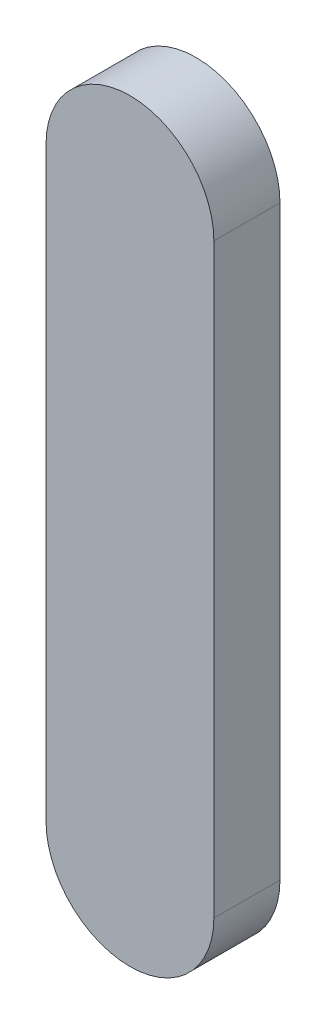
ISO-10303-21;
HEADER;
FILE_DESCRIPTION(('STEP AP214'),'2;1');
FILE_NAME('part.step','',(''),(''),'','','');
FILE_SCHEMA(('AUTOMOTIVE_DESIGN { 1 0 10303 214 1 1 1 1 }'));
ENDSEC;
DATA;
#1=APPLICATION_CONTEXT('core data for automotive mechanical design processes');
#2=APPLICATION_PROTOCOL_DEFINITION('international standard','automotive_design',2000,#1);
#3=PRODUCT_CONTEXT('',#1,'mechanical');
#4=PRODUCT('Part','Part','',(#3));
#5=PRODUCT_RELATED_PRODUCT_CATEGORY('part','',(#4));
#6=PRODUCT_DEFINITION_FORMATION('','',#4);
#7=PRODUCT_DEFINITION_CONTEXT('part definition',#1,'design');
#8=PRODUCT_DEFINITION('design','',#6,#7);
#9=PRODUCT_DEFINITION_SHAPE('','',#8);
#10=(LENGTH_UNIT() NAMED_UNIT(*) SI_UNIT(.MILLI.,.METRE.));
#11=(NAMED_UNIT(*) PLANE_ANGLE_UNIT() SI_UNIT($,.RADIAN.));
#12=(NAMED_UNIT(*) SI_UNIT($,.STERADIAN.) SOLID_ANGLE_UNIT());
#13=UNCERTAINTY_MEASURE_WITH_UNIT(LENGTH_MEASURE(1.E-05),#10,'distance_accuracy_value','');
#14=(GEOMETRIC_REPRESENTATION_CONTEXT(3) GLOBAL_UNCERTAINTY_ASSIGNED_CONTEXT((#13)) GLOBAL_UNIT_ASSIGNED_CONTEXT((#10,
#11,#12)) REPRESENTATION_CONTEXT('',''));
#15=CARTESIAN_POINT('',(0.,0.,0.));
#16=DIRECTION('',(0.,0.,1.));
#17=DIRECTION('',(1.,0.,0.));
#18=AXIS2_PLACEMENT_3D('',#15,#16,#17);
#19=CARTESIAN_POINT('',(103.0986,114.785648,0.));
#20=DIRECTION('',(-1.,0.,0.));
#21=DIRECTION('',(0.,1.,0.));
#22=AXIS2_PLACEMENT_3D('',#19,#20,#21);
#23=PLANE('',#22);
#24=DIRECTION('',(0.,1.,0.));
#25=VECTOR('',#24,1.);
#26=CARTESIAN_POINT('',(103.0986,114.785648,0.1999996));
#27=LINE('',#26,#25);
#28=CARTESIAN_POINT('',(103.0986,114.785648,0.1999996));
#29=VERTEX_POINT('',#28);
#30=CARTESIAN_POINT('',(103.0986,116.5606,0.1999996));
#31=VERTEX_POINT('',#30);
#32=EDGE_CURVE('E11',#29,#31,#27,.T.);
#33=ORIENTED_EDGE('',*,*,#32,.F.);
#34=DIRECTION('',(0.,0.,1.));
#35=VECTOR('',#34,1.);
#36=CARTESIAN_POINT('',(103.0986,114.785648,0.));
#37=LINE('',#36,#35);
#38=CARTESIAN_POINT('',(103.0986,114.785648,0.));
#39=VERTEX_POINT('',#38);
#40=EDGE_CURVE('E24',#39,#29,#37,.T.);
#41=ORIENTED_EDGE('',*,*,#40,.F.);
#42=DIRECTION('',(0.,1.,0.));
#43=VECTOR('',#42,1.);
#44=CARTESIAN_POINT('',(103.0986,114.785648,0.));
#45=LINE('',#44,#43);
#46=CARTESIAN_POINT('',(103.0986,116.5606,0.));
#47=VERTEX_POINT('',#46);
#48=EDGE_CURVE('E75',#39,#47,#45,.T.);
#49=ORIENTED_EDGE('',*,*,#48,.T.);
#50=DIRECTION('',(0.,0.,1.));
#51=VECTOR('',#50,1.);
#52=CARTESIAN_POINT('',(103.0986,116.5606,0.));
#53=LINE('',#52,#51);
#54=EDGE_CURVE('E37',#47,#31,#53,.T.);
#55=ORIENTED_EDGE('',*,*,#54,.T.);
#56=EDGE_LOOP('',(#33,#41,#49,#55));
#57=FACE_BOUND('',#56,.T.);
#58=ADVANCED_FACE('F17',(#57),#23,.F.);
#59=CARTESIAN_POINT('',(102.8446,116.5606,0.));
#60=DIRECTION('',(0.,0.,-1.));
#61=DIRECTION('',(1.,0.,0.));
#62=AXIS2_PLACEMENT_3D('',#59,#60,#61);
#63=CYLINDRICAL_SURFACE('',#62,0.254);
#64=CARTESIAN_POINT('',(102.8446,116.5606,0.1999996));
#65=DIRECTION('',(0.,0.,1.));
#66=DIRECTION('',(1.,0.,0.));
#67=AXIS2_PLACEMENT_3D('',#64,#65,#66);
#68=CIRCLE('',#67,0.254);
#69=CARTESIAN_POINT('',(102.5906,116.5606,0.1999996));
#70=VERTEX_POINT('',#69);
#71=EDGE_CURVE('E83',#31,#70,#68,.T.);
#72=ORIENTED_EDGE('',*,*,#71,.F.);
#73=ORIENTED_EDGE('',*,*,#54,.F.);
#74=CARTESIAN_POINT('',(102.8446,116.5606,0.));
#75=DIRECTION('',(0.,0.,1.));
#76=DIRECTION('',(1.,0.,0.));
#77=AXIS2_PLACEMENT_3D('',#74,#75,#76);
#78=CIRCLE('',#77,0.254);
#79=CARTESIAN_POINT('',(102.5906,116.5606,0.));
#80=VERTEX_POINT('',#79);
#81=EDGE_CURVE('E81',#47,#80,#78,.T.);
#82=ORIENTED_EDGE('',*,*,#81,.T.);
#83=DIRECTION('',(0.,0.,1.));
#84=VECTOR('',#83,1.);
#85=CARTESIAN_POINT('',(102.5906,116.5606,0.));
#86=LINE('',#85,#84);
#87=EDGE_CURVE('E67',#80,#70,#86,.T.);
#88=ORIENTED_EDGE('',*,*,#87,.T.);
#89=EDGE_LOOP('',(#72,#73,#82,#88));
#90=FACE_BOUND('',#89,.T.);
#91=ADVANCED_FACE('F89',(#90),#63,.T.);
#92=CARTESIAN_POINT('',(102.5906,116.5606,0.));
#93=DIRECTION('',(1.,0.,0.));
#94=DIRECTION('',(0.,-1.,0.));
#95=AXIS2_PLACEMENT_3D('',#92,#93,#94);
#96=PLANE('',#95);
#97=DIRECTION('',(0.,-1.,0.));
#98=VECTOR('',#97,1.);
#99=CARTESIAN_POINT('',(102.5906,116.5606,0.1999996));
#100=LINE('',#99,#98);
#101=CARTESIAN_POINT('',(102.5906,114.785648,0.1999996));
#102=VERTEX_POINT('',#101);
#103=EDGE_CURVE('E71',#70,#102,#100,.T.);
#104=ORIENTED_EDGE('',*,*,#103,.F.);
#105=ORIENTED_EDGE('',*,*,#87,.F.);
#106=DIRECTION('',(0.,-1.,0.));
#107=VECTOR('',#106,1.);
#108=CARTESIAN_POINT('',(102.5906,116.5606,0.));
#109=LINE('',#108,#107);
#110=CARTESIAN_POINT('',(102.5906,114.785648,0.));
#111=VERTEX_POINT('',#110);
#112=EDGE_CURVE('E63',#80,#111,#109,.T.);
#113=ORIENTED_EDGE('',*,*,#112,.T.);
#114=DIRECTION('',(0.,0.,1.));
#115=VECTOR('',#114,1.);
#116=CARTESIAN_POINT('',(102.5906,114.785648,0.));
#117=LINE('',#116,#115);
#118=EDGE_CURVE('E53',#111,#102,#117,.T.);
#119=ORIENTED_EDGE('',*,*,#118,.T.);
#120=EDGE_LOOP('',(#104,#105,#113,#119));
#121=FACE_BOUND('',#120,.T.);
#122=ADVANCED_FACE('F66',(#121),#96,.F.);
#123=CARTESIAN_POINT('',(102.8446,114.785648,0.));
#124=DIRECTION('',(0.,0.,-1.));
#125=DIRECTION('',(-1.,0.,0.));
#126=AXIS2_PLACEMENT_3D('',#123,#124,#125);
#127=CYLINDRICAL_SURFACE('',#126,0.254000000000005);
#128=CARTESIAN_POINT('',(102.8446,114.785648,0.1999996));
#129=DIRECTION('',(0.,0.,1.));
#130=DIRECTION('',(-1.,0.,0.));
#131=AXIS2_PLACEMENT_3D('',#128,#129,#130);
#132=CIRCLE('',#131,0.254000000000005);
#133=EDGE_CURVE('E59',#102,#29,#132,.T.);
#134=ORIENTED_EDGE('',*,*,#133,.F.);
#135=ORIENTED_EDGE('',*,*,#118,.F.);
#136=CARTESIAN_POINT('',(102.8446,114.785648,0.));
#137=DIRECTION('',(0.,0.,1.));
#138=DIRECTION('',(-1.,0.,0.));
#139=AXIS2_PLACEMENT_3D('',#136,#137,#138);
#140=CIRCLE('',#139,0.254000000000005);
#141=EDGE_CURVE('E57',#111,#39,#140,.T.);
#142=ORIENTED_EDGE('',*,*,#141,.T.);
#143=ORIENTED_EDGE('',*,*,#40,.T.);
#144=EDGE_LOOP('',(#134,#135,#142,#143));
#145=FACE_BOUND('',#144,.T.);
#146=ADVANCED_FACE('F55',(#145),#127,.T.);
#147=CARTESIAN_POINT('',(103.0986,114.785648,0.));
#148=DIRECTION('',(0.,0.,-1.));
#149=DIRECTION('',(-1.,0.,0.));
#150=AXIS2_PLACEMENT_3D('',#147,#148,#149);
#151=PLANE('',#150);
#152=ORIENTED_EDGE('',*,*,#141,.F.);
#153=ORIENTED_EDGE('',*,*,#112,.F.);
#154=ORIENTED_EDGE('',*,*,#81,.F.);
#155=ORIENTED_EDGE('',*,*,#48,.F.);
#156=EDGE_LOOP('',(#152,#153,#154,#155));
#157=FACE_BOUND('',#156,.T.);
#158=ADVANCED_FACE('F74',(#157),#151,.T.);
#159=CARTESIAN_POINT('',(103.0986,114.785648,0.1999996));
#160=DIRECTION('',(0.,0.,-1.));
#161=DIRECTION('',(-1.,0.,0.));
#162=AXIS2_PLACEMENT_3D('',#159,#160,#161);
#163=PLANE('',#162);
#164=ORIENTED_EDGE('',*,*,#32,.T.);
#165=ORIENTED_EDGE('',*,*,#71,.T.);
#166=ORIENTED_EDGE('',*,*,#103,.T.);
#167=ORIENTED_EDGE('',*,*,#133,.T.);
#168=EDGE_LOOP('',(#164,#165,#166,#167));
#169=FACE_BOUND('',#168,.T.);
#170=ADVANCED_FACE('F91',(#169),#163,.F.);
#171=CLOSED_SHELL('',(#58,#91,#122,#146,#158,#170));
#172=MANIFOLD_SOLID_BREP('B1',#171);
#173=ADVANCED_BREP_SHAPE_REPRESENTATION('',(#18,#172),#14);
#174=SHAPE_DEFINITION_REPRESENTATION(#9,#173);
ENDSEC;
END-ISO-10303-21;
